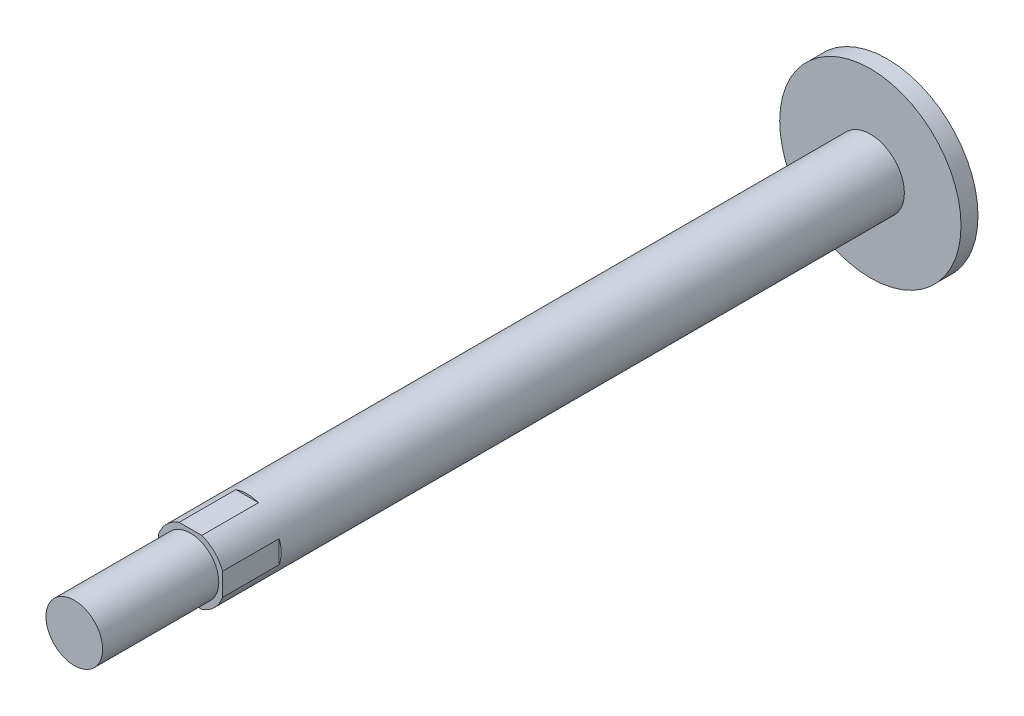
ISO-10303-21;
HEADER;
FILE_DESCRIPTION(('STEP AP214'),'2;1');
FILE_NAME('part.step','',(''),(''),'','','');
FILE_SCHEMA(('AUTOMOTIVE_DESIGN { 1 0 10303 214 1 1 1 1 }'));
ENDSEC;
DATA;
#1=APPLICATION_CONTEXT('core data for automotive mechanical design processes');
#2=APPLICATION_PROTOCOL_DEFINITION('international standard','automotive_design',2000,#1);
#3=PRODUCT_CONTEXT('',#1,'mechanical');
#4=PRODUCT('Part','Part','',(#3));
#5=PRODUCT_RELATED_PRODUCT_CATEGORY('part','',(#4));
#6=PRODUCT_DEFINITION_FORMATION('','',#4);
#7=PRODUCT_DEFINITION_CONTEXT('part definition',#1,'design');
#8=PRODUCT_DEFINITION('design','',#6,#7);
#9=PRODUCT_DEFINITION_SHAPE('','',#8);
#10=(LENGTH_UNIT() NAMED_UNIT(*) SI_UNIT(.MILLI.,.METRE.));
#11=(NAMED_UNIT(*) PLANE_ANGLE_UNIT() SI_UNIT($,.RADIAN.));
#12=(NAMED_UNIT(*) SI_UNIT($,.STERADIAN.) SOLID_ANGLE_UNIT());
#13=UNCERTAINTY_MEASURE_WITH_UNIT(LENGTH_MEASURE(1.E-05),#10,'distance_accuracy_value','');
#14=(GEOMETRIC_REPRESENTATION_CONTEXT(3) GLOBAL_UNCERTAINTY_ASSIGNED_CONTEXT((#13)) GLOBAL_UNIT_ASSIGNED_CONTEXT((#10,
#11,#12)) REPRESENTATION_CONTEXT('',''));
#15=CARTESIAN_POINT('',(0.,0.,0.));
#16=DIRECTION('',(0.,0.,1.));
#17=DIRECTION('',(1.,0.,0.));
#18=AXIS2_PLACEMENT_3D('',#15,#16,#17);
#19=CARTESIAN_POINT('',(0.,-3.75000000000002,92.25));
#20=DIRECTION('',(0.,0.,1.));
#21=DIRECTION('',(0.,-1.,0.));
#22=AXIS2_PLACEMENT_3D('',#19,#20,#21);
#23=PLANE('',#22);
#24=CARTESIAN_POINT('',(0.,0.,92.25));
#25=DIRECTION('',(0.,0.,-1.));
#26=DIRECTION('',(0.,1.,0.));
#27=AXIS2_PLACEMENT_3D('',#24,#25,#26);
#28=CIRCLE('',#27,3.75000000000001);
#29=CARTESIAN_POINT('',(0.,3.75,92.25));
#30=VERTEX_POINT('',#29);
#31=EDGE_CURVE('E47',#30,#30,#28,.T.);
#32=ORIENTED_EDGE('',*,*,#31,.T.);
#33=EDGE_LOOP('',(#32));
#34=FACE_BOUND('',#33,.T.);
#35=CARTESIAN_POINT('',(0.,0.,92.25));
#36=DIRECTION('',(0.,0.,-1.));
#37=DIRECTION('',(0.,1.,0.));
#38=AXIS2_PLACEMENT_3D('',#35,#36,#37);
#39=CIRCLE('',#38,4.50000000000001);
#40=CARTESIAN_POINT('',(1.50000000000002,4.24264068711928,92.25));
#41=VERTEX_POINT('',#40);
#42=CARTESIAN_POINT('',(4.24264068711929,1.49999999999999,92.25));
#43=VERTEX_POINT('',#42);
#44=EDGE_CURVE('E168',#41,#43,#39,.T.);
#45=ORIENTED_EDGE('',*,*,#44,.F.);
#46=DIRECTION('',(-1.,0.,0.));
#47=VECTOR('',#46,1.);
#48=CARTESIAN_POINT('',(1.50000000000002,4.24264068711928,92.25));
#49=LINE('',#48,#47);
#50=CARTESIAN_POINT('',(-1.49999999999999,4.24264068711929,92.25));
#51=VERTEX_POINT('',#50);
#52=EDGE_CURVE('E113',#41,#51,#49,.T.);
#53=ORIENTED_EDGE('',*,*,#52,.T.);
#54=CARTESIAN_POINT('',(-4.24264068711929,1.49999999999999,92.25));
#55=VERTEX_POINT('',#54);
#56=EDGE_CURVE('E119',#55,#51,#39,.T.);
#57=ORIENTED_EDGE('',*,*,#56,.F.);
#58=DIRECTION('',(0.,-1.,0.));
#59=VECTOR('',#58,1.);
#60=CARTESIAN_POINT('',(-4.24264068711929,1.49999999999999,92.25));
#61=LINE('',#60,#59);
#62=CARTESIAN_POINT('',(-4.24264068711929,-1.50000000000001,92.25));
#63=VERTEX_POINT('',#62);
#64=EDGE_CURVE('E140',#55,#63,#61,.T.);
#65=ORIENTED_EDGE('',*,*,#64,.T.);
#66=CARTESIAN_POINT('',(-1.50000000000002,-4.2426406871193,92.25));
#67=VERTEX_POINT('',#66);
#68=EDGE_CURVE('E171',#67,#63,#39,.T.);
#69=ORIENTED_EDGE('',*,*,#68,.F.);
#70=DIRECTION('',(-1.,0.,0.));
#71=VECTOR('',#70,1.);
#72=CARTESIAN_POINT('',(1.49999999999999,-4.24264068711931,92.25));
#73=LINE('',#72,#71);
#74=CARTESIAN_POINT('',(1.49999999999999,-4.24264068711931,92.25));
#75=VERTEX_POINT('',#74);
#76=EDGE_CURVE('E121',#75,#67,#73,.T.);
#77=ORIENTED_EDGE('',*,*,#76,.F.);
#78=CARTESIAN_POINT('',(4.24264068711929,-1.50000000000001,92.25));
#79=VERTEX_POINT('',#78);
#80=EDGE_CURVE('E169',#79,#75,#39,.T.);
#81=ORIENTED_EDGE('',*,*,#80,.F.);
#82=DIRECTION('',(0.,-1.,0.));
#83=VECTOR('',#82,1.);
#84=CARTESIAN_POINT('',(4.24264068711929,1.49999999999999,92.25));
#85=LINE('',#84,#83);
#86=EDGE_CURVE('E143',#43,#79,#85,.T.);
#87=ORIENTED_EDGE('',*,*,#86,.F.);
#88=EDGE_LOOP('',(#45,#53,#57,#65,#69,#77,#81,#87));
#89=FACE_BOUND('',#88,.T.);
#90=ADVANCED_FACE('F39',(#34,#89),#23,.T.);
#91=CARTESIAN_POINT('',(0.,0.,0.));
#92=DIRECTION('',(0.,0.,-1.));
#93=DIRECTION('',(0.,1.,0.));
#94=AXIS2_PLACEMENT_3D('',#91,#92,#93);
#95=CYLINDRICAL_SURFACE('',#94,4.50000000000001);
#96=CARTESIAN_POINT('',(0.,0.,2.25));
#97=DIRECTION('',(0.,0.,-1.));
#98=DIRECTION('',(0.,1.,0.));
#99=AXIS2_PLACEMENT_3D('',#96,#97,#98);
#100=CIRCLE('',#99,4.5);
#101=CARTESIAN_POINT('',(0.,4.5,2.25));
#102=VERTEX_POINT('',#101);
#103=EDGE_CURVE('E165',#102,#102,#100,.T.);
#104=ORIENTED_EDGE('',*,*,#103,.F.);
#105=EDGE_LOOP('',(#104));
#106=FACE_BOUND('',#105,.T.);
#107=CARTESIAN_POINT('',(0.,0.,84.75));
#108=DIRECTION('',(0.,0.,1.));
#109=DIRECTION('',(0.,-1.,0.));
#110=AXIS2_PLACEMENT_3D('',#107,#108,#109);
#111=CIRCLE('',#110,4.50000000000001);
#112=CARTESIAN_POINT('',(1.50000000000001,4.24264068711928,84.75));
#113=VERTEX_POINT('',#112);
#114=CARTESIAN_POINT('',(-1.49999999999999,4.24264068711929,84.75));
#115=VERTEX_POINT('',#114);
#116=EDGE_CURVE('E109',#113,#115,#111,.T.);
#117=ORIENTED_EDGE('',*,*,#116,.F.);
#118=DIRECTION('',(0.,0.,1.));
#119=VECTOR('',#118,1.);
#120=CARTESIAN_POINT('',(1.50000000000001,4.24264068711928,84.75));
#121=LINE('',#120,#119);
#122=EDGE_CURVE('E107',#113,#41,#121,.T.);
#123=ORIENTED_EDGE('',*,*,#122,.T.);
#124=ORIENTED_EDGE('',*,*,#44,.T.);
#125=DIRECTION('',(0.,0.,1.));
#126=VECTOR('',#125,1.);
#127=CARTESIAN_POINT('',(4.24264068711929,1.49999999999999,84.75));
#128=LINE('',#127,#126);
#129=CARTESIAN_POINT('',(4.24264068711929,1.49999999999999,84.75));
#130=VERTEX_POINT('',#129);
#131=EDGE_CURVE('E152',#130,#43,#128,.T.);
#132=ORIENTED_EDGE('',*,*,#131,.F.);
#133=CARTESIAN_POINT('',(0.,0.,84.75));
#134=DIRECTION('',(0.,0.,1.));
#135=DIRECTION('',(1.,0.,0.));
#136=AXIS2_PLACEMENT_3D('',#133,#134,#135);
#137=CIRCLE('',#136,4.50000000000001);
#138=CARTESIAN_POINT('',(4.24264068711929,-1.50000000000001,84.75));
#139=VERTEX_POINT('',#138);
#140=EDGE_CURVE('E148',#139,#130,#137,.T.);
#141=ORIENTED_EDGE('',*,*,#140,.F.);
#142=DIRECTION('',(0.,0.,1.));
#143=VECTOR('',#142,1.);
#144=CARTESIAN_POINT('',(4.24264068711929,-1.50000000000001,84.75));
#145=LINE('',#144,#143);
#146=EDGE_CURVE('E154',#139,#79,#145,.T.);
#147=ORIENTED_EDGE('',*,*,#146,.T.);
#148=ORIENTED_EDGE('',*,*,#80,.T.);
#149=DIRECTION('',(0.,0.,1.));
#150=VECTOR('',#149,1.);
#151=CARTESIAN_POINT('',(1.49999999999998,-4.24264068711931,84.75));
#152=LINE('',#151,#150);
#153=CARTESIAN_POINT('',(1.49999999999998,-4.24264068711931,84.75));
#154=VERTEX_POINT('',#153);
#155=EDGE_CURVE('E128',#154,#75,#152,.T.);
#156=ORIENTED_EDGE('',*,*,#155,.F.);
#157=CARTESIAN_POINT('',(0.,0.,84.75));
#158=DIRECTION('',(0.,0.,1.));
#159=DIRECTION('',(0.,-1.,0.));
#160=AXIS2_PLACEMENT_3D('',#157,#158,#159);
#161=CIRCLE('',#160,4.50000000000001);
#162=CARTESIAN_POINT('',(-1.50000000000002,-4.2426406871193,84.75));
#163=VERTEX_POINT('',#162);
#164=EDGE_CURVE('E125',#163,#154,#161,.T.);
#165=ORIENTED_EDGE('',*,*,#164,.F.);
#166=DIRECTION('',(0.,0.,1.));
#167=VECTOR('',#166,1.);
#168=CARTESIAN_POINT('',(-1.50000000000002,-4.2426406871193,84.75));
#169=LINE('',#168,#167);
#170=EDGE_CURVE('E130',#163,#67,#169,.T.);
#171=ORIENTED_EDGE('',*,*,#170,.T.);
#172=ORIENTED_EDGE('',*,*,#68,.T.);
#173=DIRECTION('',(0.,0.,1.));
#174=VECTOR('',#173,1.);
#175=CARTESIAN_POINT('',(-4.24264068711929,-1.50000000000001,84.75));
#176=LINE('',#175,#174);
#177=CARTESIAN_POINT('',(-4.24264068711929,-1.50000000000001,84.75));
#178=VERTEX_POINT('',#177);
#179=EDGE_CURVE('E135',#178,#63,#176,.T.);
#180=ORIENTED_EDGE('',*,*,#179,.F.);
#181=CARTESIAN_POINT('',(0.,0.,84.75));
#182=DIRECTION('',(0.,0.,1.));
#183=DIRECTION('',(1.,0.,0.));
#184=AXIS2_PLACEMENT_3D('',#181,#182,#183);
#185=CIRCLE('',#184,4.50000000000001);
#186=CARTESIAN_POINT('',(-4.24264068711929,1.49999999999999,84.75));
#187=VERTEX_POINT('',#186);
#188=EDGE_CURVE('E144',#187,#178,#185,.T.);
#189=ORIENTED_EDGE('',*,*,#188,.F.);
#190=DIRECTION('',(0.,0.,1.));
#191=VECTOR('',#190,1.);
#192=CARTESIAN_POINT('',(-4.24264068711929,1.49999999999999,84.75));
#193=LINE('',#192,#191);
#194=EDGE_CURVE('E133',#187,#55,#193,.T.);
#195=ORIENTED_EDGE('',*,*,#194,.T.);
#196=ORIENTED_EDGE('',*,*,#56,.T.);
#197=DIRECTION('',(0.,0.,1.));
#198=VECTOR('',#197,1.);
#199=CARTESIAN_POINT('',(-1.49999999999999,4.24264068711929,84.75));
#200=LINE('',#199,#198);
#201=EDGE_CURVE('E104',#115,#51,#200,.T.);
#202=ORIENTED_EDGE('',*,*,#201,.F.);
#203=EDGE_LOOP('',(#117,#123,#124,#132,#141,#147,#148,#156,#165,#171,#172,#180,#189,#195,#196,#202));
#204=FACE_BOUND('',#203,.T.);
#205=ADVANCED_FACE('F116',(#106,#204),#95,.T.);
#206=CARTESIAN_POINT('',(0.,-12.,0.));
#207=DIRECTION('',(0.,0.,-1.));
#208=DIRECTION('',(0.,1.,0.));
#209=AXIS2_PLACEMENT_3D('',#206,#207,#208);
#210=PLANE('',#209);
#211=CARTESIAN_POINT('',(0.,0.,0.));
#212=DIRECTION('',(0.,0.,-1.));
#213=DIRECTION('',(0.,1.,0.));
#214=AXIS2_PLACEMENT_3D('',#211,#212,#213);
#215=CIRCLE('',#214,12.);
#216=CARTESIAN_POINT('',(0.,12.,0.));
#217=VERTEX_POINT('',#216);
#218=EDGE_CURVE('E157',#217,#217,#215,.T.);
#219=ORIENTED_EDGE('',*,*,#218,.T.);
#220=EDGE_LOOP('',(#219));
#221=FACE_BOUND('',#220,.T.);
#222=ADVANCED_FACE('F41',(#221),#210,.T.);
#223=CARTESIAN_POINT('',(0.,0.,107.625));
#224=DIRECTION('',(0.,0.,1.));
#225=DIRECTION('',(0.,-1.,0.));
#226=AXIS2_PLACEMENT_3D('',#223,#224,#225);
#227=PLANE('',#226);
#228=CARTESIAN_POINT('',(0.,0.,107.625));
#229=DIRECTION('',(0.,0.,-1.));
#230=DIRECTION('',(0.,1.,0.));
#231=AXIS2_PLACEMENT_3D('',#228,#229,#230);
#232=CIRCLE('',#231,3.75000000000001);
#233=CARTESIAN_POINT('',(0.,3.75,107.625));
#234=VERTEX_POINT('',#233);
#235=EDGE_CURVE('E11',#234,#234,#232,.T.);
#236=ORIENTED_EDGE('',*,*,#235,.F.);
#237=EDGE_LOOP('',(#236));
#238=FACE_BOUND('',#237,.T.);
#239=ADVANCED_FACE('F180',(#238),#227,.T.);
#240=CARTESIAN_POINT('',(0.,0.,0.));
#241=DIRECTION('',(0.,0.,-1.));
#242=DIRECTION('',(0.,1.,0.));
#243=AXIS2_PLACEMENT_3D('',#240,#241,#242);
#244=CYLINDRICAL_SURFACE('',#243,3.75000000000001);
#245=ORIENTED_EDGE('',*,*,#235,.T.);
#246=EDGE_LOOP('',(#245));
#247=FACE_BOUND('',#246,.T.);
#248=ORIENTED_EDGE('',*,*,#31,.F.);
#249=EDGE_LOOP('',(#248));
#250=FACE_BOUND('',#249,.T.);
#251=ADVANCED_FACE('F177',(#247,#250),#244,.T.);
#252=CARTESIAN_POINT('',(0.,-4.5,2.25));
#253=DIRECTION('',(0.,0.,1.));
#254=DIRECTION('',(0.,-1.,0.));
#255=AXIS2_PLACEMENT_3D('',#252,#253,#254);
#256=PLANE('',#255);
#257=ORIENTED_EDGE('',*,*,#103,.T.);
#258=EDGE_LOOP('',(#257));
#259=FACE_BOUND('',#258,.T.);
#260=CARTESIAN_POINT('',(0.,0.,2.25000000000001));
#261=DIRECTION('',(0.,0.,-1.));
#262=DIRECTION('',(0.,1.,0.));
#263=AXIS2_PLACEMENT_3D('',#260,#261,#262);
#264=CIRCLE('',#263,12.);
#265=CARTESIAN_POINT('',(0.,12.,2.25000000000001));
#266=VERTEX_POINT('',#265);
#267=EDGE_CURVE('E162',#266,#266,#264,.T.);
#268=ORIENTED_EDGE('',*,*,#267,.F.);
#269=EDGE_LOOP('',(#268));
#270=FACE_BOUND('',#269,.T.);
#271=ADVANCED_FACE('F179',(#259,#270),#256,.T.);
#272=CARTESIAN_POINT('',(0.,0.,0.));
#273=DIRECTION('',(0.,0.,-1.));
#274=DIRECTION('',(0.,1.,0.));
#275=AXIS2_PLACEMENT_3D('',#272,#273,#274);
#276=CYLINDRICAL_SURFACE('',#275,12.);
#277=ORIENTED_EDGE('',*,*,#267,.T.);
#278=EDGE_LOOP('',(#277));
#279=FACE_BOUND('',#278,.T.);
#280=ORIENTED_EDGE('',*,*,#218,.F.);
#281=EDGE_LOOP('',(#280));
#282=FACE_BOUND('',#281,.T.);
#283=ADVANCED_FACE('F187',(#279,#282),#276,.T.);
#284=CARTESIAN_POINT('',(4.24264068711929,1.49999999999999,84.75));
#285=DIRECTION('',(-1.,0.,0.));
#286=DIRECTION('',(0.,0.,1.));
#287=AXIS2_PLACEMENT_3D('',#284,#285,#286);
#288=PLANE('',#287);
#289=ORIENTED_EDGE('',*,*,#86,.T.);
#290=ORIENTED_EDGE('',*,*,#146,.F.);
#291=DIRECTION('',(0.,-1.,0.));
#292=VECTOR('',#291,1.);
#293=CARTESIAN_POINT('',(4.24264068711929,1.49999999999999,84.75));
#294=LINE('',#293,#292);
#295=EDGE_CURVE('E150',#130,#139,#294,.T.);
#296=ORIENTED_EDGE('',*,*,#295,.F.);
#297=ORIENTED_EDGE('',*,*,#131,.T.);
#298=EDGE_LOOP('',(#289,#290,#296,#297));
#299=FACE_BOUND('',#298,.T.);
#300=ADVANCED_FACE('F201',(#299),#288,.F.);
#301=CARTESIAN_POINT('',(0.,0.,84.75));
#302=DIRECTION('',(0.,0.,1.));
#303=DIRECTION('',(1.,0.,0.));
#304=AXIS2_PLACEMENT_3D('',#301,#302,#303);
#305=PLANE('',#304);
#306=ORIENTED_EDGE('',*,*,#140,.T.);
#307=ORIENTED_EDGE('',*,*,#295,.T.);
#308=EDGE_LOOP('',(#306,#307));
#309=FACE_BOUND('',#308,.T.);
#310=ADVANCED_FACE('F205',(#309),#305,.T.);
#311=CARTESIAN_POINT('',(-4.24264068711929,1.49999999999999,84.75));
#312=DIRECTION('',(-1.,0.,0.));
#313=DIRECTION('',(0.,0.,1.));
#314=AXIS2_PLACEMENT_3D('',#311,#312,#313);
#315=PLANE('',#314);
#316=ORIENTED_EDGE('',*,*,#64,.F.);
#317=ORIENTED_EDGE('',*,*,#194,.F.);
#318=DIRECTION('',(0.,-1.,0.));
#319=VECTOR('',#318,1.);
#320=CARTESIAN_POINT('',(-4.24264068711929,1.49999999999999,84.75));
#321=LINE('',#320,#319);
#322=EDGE_CURVE('E138',#187,#178,#321,.T.);
#323=ORIENTED_EDGE('',*,*,#322,.T.);
#324=ORIENTED_EDGE('',*,*,#179,.T.);
#325=EDGE_LOOP('',(#316,#317,#323,#324));
#326=FACE_BOUND('',#325,.T.);
#327=ADVANCED_FACE('F209',(#326),#315,.T.);
#328=CARTESIAN_POINT('',(0.,0.,84.75));
#329=DIRECTION('',(0.,0.,1.));
#330=DIRECTION('',(1.,0.,0.));
#331=AXIS2_PLACEMENT_3D('',#328,#329,#330);
#332=PLANE('',#331);
#333=ORIENTED_EDGE('',*,*,#188,.T.);
#334=ORIENTED_EDGE('',*,*,#322,.F.);
#335=EDGE_LOOP('',(#333,#334));
#336=FACE_BOUND('',#335,.T.);
#337=ADVANCED_FACE('F211',(#336),#332,.T.);
#338=CARTESIAN_POINT('',(1.49999999999998,-4.24264068711931,84.75));
#339=DIRECTION('',(0.,1.,0.));
#340=DIRECTION('',(-1.,0.,0.));
#341=AXIS2_PLACEMENT_3D('',#338,#339,#340);
#342=PLANE('',#341);
#343=ORIENTED_EDGE('',*,*,#76,.T.);
#344=ORIENTED_EDGE('',*,*,#170,.F.);
#345=DIRECTION('',(-1.,0.,0.));
#346=VECTOR('',#345,1.);
#347=CARTESIAN_POINT('',(1.49999999999998,-4.24264068711931,84.75));
#348=LINE('',#347,#346);
#349=EDGE_CURVE('E60',#154,#163,#348,.T.);
#350=ORIENTED_EDGE('',*,*,#349,.F.);
#351=ORIENTED_EDGE('',*,*,#155,.T.);
#352=EDGE_LOOP('',(#343,#344,#350,#351));
#353=FACE_BOUND('',#352,.T.);
#354=ADVANCED_FACE('F214',(#353),#342,.F.);
#355=CARTESIAN_POINT('',(0.,0.,84.75));
#356=DIRECTION('',(0.,0.,1.));
#357=DIRECTION('',(0.,-1.,0.));
#358=AXIS2_PLACEMENT_3D('',#355,#356,#357);
#359=PLANE('',#358);
#360=ORIENTED_EDGE('',*,*,#164,.T.);
#361=ORIENTED_EDGE('',*,*,#349,.T.);
#362=EDGE_LOOP('',(#360,#361));
#363=FACE_BOUND('',#362,.T.);
#364=ADVANCED_FACE('F221',(#363),#359,.T.);
#365=CARTESIAN_POINT('',(1.50000000000001,4.24264068711928,84.75));
#366=DIRECTION('',(0.,1.,0.));
#367=DIRECTION('',(-1.,0.,0.));
#368=AXIS2_PLACEMENT_3D('',#365,#366,#367);
#369=PLANE('',#368);
#370=ORIENTED_EDGE('',*,*,#52,.F.);
#371=ORIENTED_EDGE('',*,*,#122,.F.);
#372=DIRECTION('',(-1.,0.,0.));
#373=VECTOR('',#372,1.);
#374=CARTESIAN_POINT('',(1.50000000000001,4.24264068711928,84.75));
#375=LINE('',#374,#373);
#376=EDGE_CURVE('E53',#113,#115,#375,.T.);
#377=ORIENTED_EDGE('',*,*,#376,.T.);
#378=ORIENTED_EDGE('',*,*,#201,.T.);
#379=EDGE_LOOP('',(#370,#371,#377,#378));
#380=FACE_BOUND('',#379,.T.);
#381=ADVANCED_FACE('F102',(#380),#369,.T.);
#382=CARTESIAN_POINT('',(0.,0.,84.75));
#383=DIRECTION('',(0.,0.,1.));
#384=DIRECTION('',(0.,-1.,0.));
#385=AXIS2_PLACEMENT_3D('',#382,#383,#384);
#386=PLANE('',#385);
#387=ORIENTED_EDGE('',*,*,#116,.T.);
#388=ORIENTED_EDGE('',*,*,#376,.F.);
#389=EDGE_LOOP('',(#387,#388));
#390=FACE_BOUND('',#389,.T.);
#391=ADVANCED_FACE('F111',(#390),#386,.T.);
#392=CLOSED_SHELL('',(#90,#205,#222,#239,#251,#271,#283,#300,#310,#327,#337,#354,#364,#381,#391));
#393=MANIFOLD_SOLID_BREP('B2',#392);
#394=ADVANCED_BREP_SHAPE_REPRESENTATION('',(#18,#393),#14);
#395=SHAPE_DEFINITION_REPRESENTATION(#9,#394);
ENDSEC;
END-ISO-10303-21;
